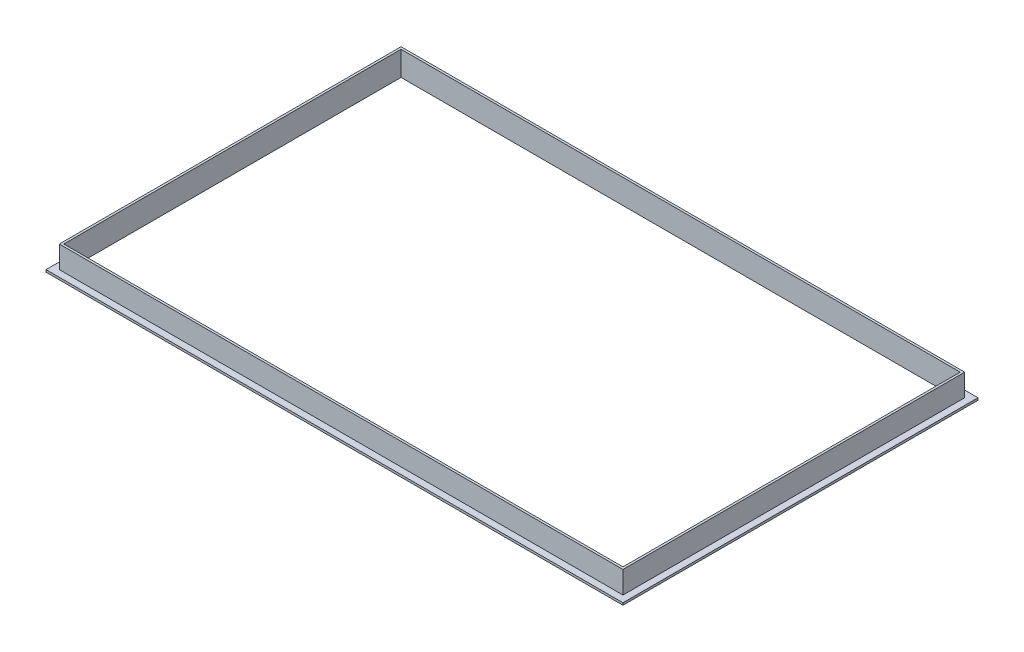
ISO-10303-21;
HEADER;
FILE_DESCRIPTION(('STEP AP214'),'2;1');
FILE_NAME('part.step','',(''),(''),'','','');
FILE_SCHEMA(('AUTOMOTIVE_DESIGN { 1 0 10303 214 1 1 1 1 }'));
ENDSEC;
DATA;
#1=APPLICATION_CONTEXT('core data for automotive mechanical design processes');
#2=APPLICATION_PROTOCOL_DEFINITION('international standard','automotive_design',2000,#1);
#3=PRODUCT_CONTEXT('',#1,'mechanical');
#4=PRODUCT('Part','Part','',(#3));
#5=PRODUCT_RELATED_PRODUCT_CATEGORY('part','',(#4));
#6=PRODUCT_DEFINITION_FORMATION('','',#4);
#7=PRODUCT_DEFINITION_CONTEXT('part definition',#1,'design');
#8=PRODUCT_DEFINITION('design','',#6,#7);
#9=PRODUCT_DEFINITION_SHAPE('','',#8);
#10=(LENGTH_UNIT() NAMED_UNIT(*) SI_UNIT(.MILLI.,.METRE.));
#11=(NAMED_UNIT(*) PLANE_ANGLE_UNIT() SI_UNIT($,.RADIAN.));
#12=(NAMED_UNIT(*) SI_UNIT($,.STERADIAN.) SOLID_ANGLE_UNIT());
#13=UNCERTAINTY_MEASURE_WITH_UNIT(LENGTH_MEASURE(1.E-05),#10,'distance_accuracy_value','');
#14=(GEOMETRIC_REPRESENTATION_CONTEXT(3) GLOBAL_UNCERTAINTY_ASSIGNED_CONTEXT((#13)) GLOBAL_UNIT_ASSIGNED_CONTEXT((#10,
#11,#12)) REPRESENTATION_CONTEXT('',''));
#15=CARTESIAN_POINT('',(0.,0.,0.));
#16=DIRECTION('',(0.,0.,1.));
#17=DIRECTION('',(1.,0.,0.));
#18=AXIS2_PLACEMENT_3D('',#15,#16,#17);
#19=CARTESIAN_POINT('',(0.,2.,0.));
#20=DIRECTION('',(0.,-1.,0.));
#21=DIRECTION('',(0.,0.,-1.));
#22=AXIS2_PLACEMENT_3D('',#19,#20,#21);
#23=PLANE('',#22);
#24=DIRECTION('',(0.,0.,1.));
#25=VECTOR('',#24,1.);
#26=CARTESIAN_POINT('',(0.,2.,0.));
#27=LINE('',#26,#25);
#28=CARTESIAN_POINT('',(0.,2.,-320.));
#29=VERTEX_POINT('',#28);
#30=CARTESIAN_POINT('',(0.,2.,0.));
#31=VERTEX_POINT('',#30);
#32=EDGE_CURVE('E191',#29,#31,#27,.T.);
#33=ORIENTED_EDGE('',*,*,#32,.T.);
#34=DIRECTION('',(1.,0.,0.));
#35=VECTOR('',#34,1.);
#36=CARTESIAN_POINT('',(0.,2.,0.));
#37=LINE('',#36,#35);
#38=CARTESIAN_POINT('',(520.,2.,0.));
#39=VERTEX_POINT('',#38);
#40=EDGE_CURVE('E194',#31,#39,#37,.T.);
#41=ORIENTED_EDGE('',*,*,#40,.T.);
#42=DIRECTION('',(0.,0.,-1.));
#43=VECTOR('',#42,1.);
#44=CARTESIAN_POINT('',(520.,2.,0.));
#45=LINE('',#44,#43);
#46=CARTESIAN_POINT('',(520.,2.,-320.));
#47=VERTEX_POINT('',#46);
#48=EDGE_CURVE('E197',#39,#47,#45,.T.);
#49=ORIENTED_EDGE('',*,*,#48,.T.);
#50=DIRECTION('',(-1.,0.,0.));
#51=VECTOR('',#50,1.);
#52=CARTESIAN_POINT('',(0.,2.,-320.));
#53=LINE('',#52,#51);
#54=EDGE_CURVE('E199',#47,#29,#53,.T.);
#55=ORIENTED_EDGE('',*,*,#54,.T.);
#56=EDGE_LOOP('',(#33,#41,#49,#55));
#57=FACE_BOUND('',#56,.T.);
#58=DIRECTION('',(0.,0.,1.));
#59=VECTOR('',#58,1.);
#60=CARTESIAN_POINT('',(6.,2.,-314.));
#61=LINE('',#60,#59);
#62=CARTESIAN_POINT('',(6.,2.,-314.));
#63=VERTEX_POINT('',#62);
#64=CARTESIAN_POINT('',(6.00000000000004,2.,-6.));
#65=VERTEX_POINT('',#64);
#66=EDGE_CURVE('E150',#63,#65,#61,.T.);
#67=ORIENTED_EDGE('',*,*,#66,.F.);
#68=DIRECTION('',(-1.,0.,0.));
#69=VECTOR('',#68,1.);
#70=CARTESIAN_POINT('',(6.,2.,-314.));
#71=LINE('',#70,#69);
#72=CARTESIAN_POINT('',(514.,2.,-314.));
#73=VERTEX_POINT('',#72);
#74=EDGE_CURVE('E155',#73,#63,#71,.T.);
#75=ORIENTED_EDGE('',*,*,#74,.F.);
#76=DIRECTION('',(0.,0.,-1.));
#77=VECTOR('',#76,1.);
#78=CARTESIAN_POINT('',(514.,2.,-314.));
#79=LINE('',#78,#77);
#80=CARTESIAN_POINT('',(514.,2.,-6.00000000000001));
#81=VERTEX_POINT('',#80);
#82=EDGE_CURVE('E53',#81,#73,#79,.T.);
#83=ORIENTED_EDGE('',*,*,#82,.F.);
#84=DIRECTION('',(1.,0.,0.));
#85=VECTOR('',#84,1.);
#86=CARTESIAN_POINT('',(6.00000000000004,2.,-6.));
#87=LINE('',#86,#85);
#88=EDGE_CURVE('E48',#65,#81,#87,.T.);
#89=ORIENTED_EDGE('',*,*,#88,.F.);
#90=EDGE_LOOP('',(#67,#75,#83,#89));
#91=FACE_BOUND('',#90,.T.);
#92=ADVANCED_FACE('F33',(#57,#91),#23,.F.);
#93=CARTESIAN_POINT('',(0.,0.,0.));
#94=DIRECTION('',(0.,-1.,0.));
#95=DIRECTION('',(0.,0.,-1.));
#96=AXIS2_PLACEMENT_3D('',#93,#94,#95);
#97=PLANE('',#96);
#98=DIRECTION('',(0.,0.,1.));
#99=VECTOR('',#98,1.);
#100=CARTESIAN_POINT('',(0.,0.,0.));
#101=LINE('',#100,#99);
#102=CARTESIAN_POINT('',(0.,0.,-320.));
#103=VERTEX_POINT('',#102);
#104=CARTESIAN_POINT('',(0.,0.,0.));
#105=VERTEX_POINT('',#104);
#106=EDGE_CURVE('E130',#103,#105,#101,.T.);
#107=ORIENTED_EDGE('',*,*,#106,.F.);
#108=DIRECTION('',(-1.,0.,0.));
#109=VECTOR('',#108,1.);
#110=CARTESIAN_POINT('',(0.,0.,-320.));
#111=LINE('',#110,#109);
#112=CARTESIAN_POINT('',(520.,0.,-320.));
#113=VERTEX_POINT('',#112);
#114=EDGE_CURVE('E195',#113,#103,#111,.T.);
#115=ORIENTED_EDGE('',*,*,#114,.F.);
#116=DIRECTION('',(0.,0.,-1.));
#117=VECTOR('',#116,1.);
#118=CARTESIAN_POINT('',(520.,0.,0.));
#119=LINE('',#118,#117);
#120=CARTESIAN_POINT('',(520.,0.,0.));
#121=VERTEX_POINT('',#120);
#122=EDGE_CURVE('E206',#121,#113,#119,.T.);
#123=ORIENTED_EDGE('',*,*,#122,.F.);
#124=DIRECTION('',(1.,0.,0.));
#125=VECTOR('',#124,1.);
#126=CARTESIAN_POINT('',(0.,0.,0.));
#127=LINE('',#126,#125);
#128=EDGE_CURVE('E204',#105,#121,#127,.T.);
#129=ORIENTED_EDGE('',*,*,#128,.F.);
#130=EDGE_LOOP('',(#107,#115,#123,#129));
#131=FACE_BOUND('',#130,.T.);
#132=DIRECTION('',(-1.,0.,0.));
#133=VECTOR('',#132,1.);
#134=CARTESIAN_POINT('',(8.,0.,-312.));
#135=LINE('',#134,#133);
#136=CARTESIAN_POINT('',(512.,0.,-312.));
#137=VERTEX_POINT('',#136);
#138=CARTESIAN_POINT('',(8.,0.,-312.));
#139=VERTEX_POINT('',#138);
#140=EDGE_CURVE('E184',#137,#139,#135,.T.);
#141=ORIENTED_EDGE('',*,*,#140,.T.);
#142=DIRECTION('',(0.,0.,1.));
#143=VECTOR('',#142,1.);
#144=CARTESIAN_POINT('',(8.,0.,-312.));
#145=LINE('',#144,#143);
#146=CARTESIAN_POINT('',(8.00000000000004,0.,-8.00000000000001));
#147=VERTEX_POINT('',#146);
#148=EDGE_CURVE('E178',#139,#147,#145,.T.);
#149=ORIENTED_EDGE('',*,*,#148,.T.);
#150=DIRECTION('',(1.,0.,0.));
#151=VECTOR('',#150,1.);
#152=CARTESIAN_POINT('',(8.00000000000004,0.,-8.00000000000001));
#153=LINE('',#152,#151);
#154=CARTESIAN_POINT('',(512.,0.,-8.));
#155=VERTEX_POINT('',#154);
#156=EDGE_CURVE('E127',#147,#155,#153,.T.);
#157=ORIENTED_EDGE('',*,*,#156,.T.);
#158=DIRECTION('',(0.,0.,-1.));
#159=VECTOR('',#158,1.);
#160=CARTESIAN_POINT('',(512.,0.,-312.));
#161=LINE('',#160,#159);
#162=EDGE_CURVE('E181',#155,#137,#161,.T.);
#163=ORIENTED_EDGE('',*,*,#162,.T.);
#164=EDGE_LOOP('',(#141,#149,#157,#163));
#165=FACE_BOUND('',#164,.T.);
#166=ADVANCED_FACE('F224',(#131,#165),#97,.T.);
#167=CARTESIAN_POINT('',(0.,2.,0.));
#168=DIRECTION('',(1.,0.,0.));
#169=DIRECTION('',(0.,0.,-1.));
#170=AXIS2_PLACEMENT_3D('',#167,#168,#169);
#171=PLANE('',#170);
#172=ORIENTED_EDGE('',*,*,#106,.T.);
#173=DIRECTION('',(0.,-1.,0.));
#174=VECTOR('',#173,1.);
#175=CARTESIAN_POINT('',(0.,2.,0.));
#176=LINE('',#175,#174);
#177=EDGE_CURVE('E11',#31,#105,#176,.T.);
#178=ORIENTED_EDGE('',*,*,#177,.F.);
#179=ORIENTED_EDGE('',*,*,#32,.F.);
#180=DIRECTION('',(0.,-1.,0.));
#181=VECTOR('',#180,1.);
#182=CARTESIAN_POINT('',(0.,2.,-320.));
#183=LINE('',#182,#181);
#184=EDGE_CURVE('E201',#29,#103,#183,.T.);
#185=ORIENTED_EDGE('',*,*,#184,.T.);
#186=EDGE_LOOP('',(#172,#178,#179,#185));
#187=FACE_BOUND('',#186,.T.);
#188=ADVANCED_FACE('F35',(#187),#171,.F.);
#189=CARTESIAN_POINT('',(0.,2.,0.));
#190=DIRECTION('',(0.,0.,-1.));
#191=DIRECTION('',(-1.,0.,0.));
#192=AXIS2_PLACEMENT_3D('',#189,#190,#191);
#193=PLANE('',#192);
#194=ORIENTED_EDGE('',*,*,#128,.T.);
#195=DIRECTION('',(0.,-1.,0.));
#196=VECTOR('',#195,1.);
#197=CARTESIAN_POINT('',(520.,2.,0.));
#198=LINE('',#197,#196);
#199=EDGE_CURVE('E41',#39,#121,#198,.T.);
#200=ORIENTED_EDGE('',*,*,#199,.F.);
#201=ORIENTED_EDGE('',*,*,#40,.F.);
#202=ORIENTED_EDGE('',*,*,#177,.T.);
#203=EDGE_LOOP('',(#194,#200,#201,#202));
#204=FACE_BOUND('',#203,.T.);
#205=ADVANCED_FACE('F234',(#204),#193,.F.);
#206=CARTESIAN_POINT('',(520.,2.,0.));
#207=DIRECTION('',(-1.,0.,0.));
#208=DIRECTION('',(0.,0.,1.));
#209=AXIS2_PLACEMENT_3D('',#206,#207,#208);
#210=PLANE('',#209);
#211=ORIENTED_EDGE('',*,*,#122,.T.);
#212=DIRECTION('',(0.,-1.,0.));
#213=VECTOR('',#212,1.);
#214=CARTESIAN_POINT('',(520.,2.,-320.));
#215=LINE('',#214,#213);
#216=EDGE_CURVE('E211',#47,#113,#215,.T.);
#217=ORIENTED_EDGE('',*,*,#216,.F.);
#218=ORIENTED_EDGE('',*,*,#48,.F.);
#219=ORIENTED_EDGE('',*,*,#199,.T.);
#220=EDGE_LOOP('',(#211,#217,#218,#219));
#221=FACE_BOUND('',#220,.T.);
#222=ADVANCED_FACE('F218',(#221),#210,.F.);
#223=CARTESIAN_POINT('',(0.,2.,-320.));
#224=DIRECTION('',(0.,0.,1.));
#225=DIRECTION('',(1.,0.,0.));
#226=AXIS2_PLACEMENT_3D('',#223,#224,#225);
#227=PLANE('',#226);
#228=ORIENTED_EDGE('',*,*,#114,.T.);
#229=ORIENTED_EDGE('',*,*,#184,.F.);
#230=ORIENTED_EDGE('',*,*,#54,.F.);
#231=ORIENTED_EDGE('',*,*,#216,.T.);
#232=EDGE_LOOP('',(#228,#229,#230,#231));
#233=FACE_BOUND('',#232,.T.);
#234=ADVANCED_FACE('F228',(#233),#227,.F.);
#235=CARTESIAN_POINT('',(8.,2.,-312.));
#236=DIRECTION('',(1.,0.,0.));
#237=DIRECTION('',(0.,0.,-1.));
#238=AXIS2_PLACEMENT_3D('',#235,#236,#237);
#239=PLANE('',#238);
#240=ORIENTED_EDGE('',*,*,#148,.F.);
#241=DIRECTION('',(0.,-1.,0.));
#242=VECTOR('',#241,1.);
#243=CARTESIAN_POINT('',(8.,2.,-312.));
#244=LINE('',#243,#242);
#245=CARTESIAN_POINT('',(8.,22.,-312.));
#246=VERTEX_POINT('',#245);
#247=EDGE_CURVE('E137',#246,#139,#244,.T.);
#248=ORIENTED_EDGE('',*,*,#247,.F.);
#249=DIRECTION('',(0.,0.,1.));
#250=VECTOR('',#249,1.);
#251=CARTESIAN_POINT('',(8.,22.,-312.));
#252=LINE('',#251,#250);
#253=CARTESIAN_POINT('',(8.00000000000004,22.,-8.));
#254=VERTEX_POINT('',#253);
#255=EDGE_CURVE('E134',#246,#254,#252,.T.);
#256=ORIENTED_EDGE('',*,*,#255,.T.);
#257=DIRECTION('',(0.,-1.,0.));
#258=VECTOR('',#257,1.);
#259=CARTESIAN_POINT('',(8.00000000000004,2.,-8.00000000000001));
#260=LINE('',#259,#258);
#261=EDGE_CURVE('E120',#254,#147,#260,.T.);
#262=ORIENTED_EDGE('',*,*,#261,.T.);
#263=EDGE_LOOP('',(#240,#248,#256,#262));
#264=FACE_BOUND('',#263,.T.);
#265=ADVANCED_FACE('F135',(#264),#239,.T.);
#266=CARTESIAN_POINT('',(8.00000000000004,2.,-8.00000000000001));
#267=DIRECTION('',(0.,0.,-1.));
#268=DIRECTION('',(-1.,0.,0.));
#269=AXIS2_PLACEMENT_3D('',#266,#267,#268);
#270=PLANE('',#269);
#271=ORIENTED_EDGE('',*,*,#156,.F.);
#272=ORIENTED_EDGE('',*,*,#261,.F.);
#273=DIRECTION('',(1.,0.,0.));
#274=VECTOR('',#273,1.);
#275=CARTESIAN_POINT('',(8.00000000000004,22.,-8.));
#276=LINE('',#275,#274);
#277=CARTESIAN_POINT('',(512.,22.,-8.));
#278=VERTEX_POINT('',#277);
#279=EDGE_CURVE('E124',#254,#278,#276,.T.);
#280=ORIENTED_EDGE('',*,*,#279,.T.);
#281=DIRECTION('',(0.,-1.,0.));
#282=VECTOR('',#281,1.);
#283=CARTESIAN_POINT('',(512.,2.,-8.));
#284=LINE('',#283,#282);
#285=EDGE_CURVE('E131',#278,#155,#284,.T.);
#286=ORIENTED_EDGE('',*,*,#285,.T.);
#287=EDGE_LOOP('',(#271,#272,#280,#286));
#288=FACE_BOUND('',#287,.T.);
#289=ADVANCED_FACE('F122',(#288),#270,.T.);
#290=CARTESIAN_POINT('',(512.,2.,-312.));
#291=DIRECTION('',(-1.,0.,0.));
#292=DIRECTION('',(0.,0.,1.));
#293=AXIS2_PLACEMENT_3D('',#290,#291,#292);
#294=PLANE('',#293);
#295=ORIENTED_EDGE('',*,*,#162,.F.);
#296=ORIENTED_EDGE('',*,*,#285,.F.);
#297=DIRECTION('',(0.,0.,-1.));
#298=VECTOR('',#297,1.);
#299=CARTESIAN_POINT('',(512.,22.,-312.));
#300=LINE('',#299,#298);
#301=CARTESIAN_POINT('',(512.,22.,-312.));
#302=VERTEX_POINT('',#301);
#303=EDGE_CURVE('E144',#278,#302,#300,.T.);
#304=ORIENTED_EDGE('',*,*,#303,.T.);
#305=DIRECTION('',(0.,-1.,0.));
#306=VECTOR('',#305,1.);
#307=CARTESIAN_POINT('',(512.,2.,-312.));
#308=LINE('',#307,#306);
#309=EDGE_CURVE('E188',#302,#137,#308,.T.);
#310=ORIENTED_EDGE('',*,*,#309,.T.);
#311=EDGE_LOOP('',(#295,#296,#304,#310));
#312=FACE_BOUND('',#311,.T.);
#313=ADVANCED_FACE('F257',(#312),#294,.T.);
#314=CARTESIAN_POINT('',(8.,2.,-312.));
#315=DIRECTION('',(0.,0.,1.));
#316=DIRECTION('',(1.,0.,0.));
#317=AXIS2_PLACEMENT_3D('',#314,#315,#316);
#318=PLANE('',#317);
#319=ORIENTED_EDGE('',*,*,#140,.F.);
#320=ORIENTED_EDGE('',*,*,#309,.F.);
#321=DIRECTION('',(-1.,0.,0.));
#322=VECTOR('',#321,1.);
#323=CARTESIAN_POINT('',(8.,22.,-312.));
#324=LINE('',#323,#322);
#325=EDGE_CURVE('E146',#302,#246,#324,.T.);
#326=ORIENTED_EDGE('',*,*,#325,.T.);
#327=ORIENTED_EDGE('',*,*,#247,.T.);
#328=EDGE_LOOP('',(#319,#320,#326,#327));
#329=FACE_BOUND('',#328,.T.);
#330=ADVANCED_FACE('F261',(#329),#318,.T.);
#331=CARTESIAN_POINT('',(0.,22.,0.));
#332=DIRECTION('',(0.,1.,0.));
#333=DIRECTION('',(0.,0.,1.));
#334=AXIS2_PLACEMENT_3D('',#331,#332,#333);
#335=PLANE('',#334);
#336=DIRECTION('',(0.,0.,1.));
#337=VECTOR('',#336,1.);
#338=CARTESIAN_POINT('',(6.,22.,-314.));
#339=LINE('',#338,#337);
#340=CARTESIAN_POINT('',(6.,22.,-314.));
#341=VERTEX_POINT('',#340);
#342=CARTESIAN_POINT('',(6.00000000000004,22.,-6.));
#343=VERTEX_POINT('',#342);
#344=EDGE_CURVE('E151',#341,#343,#339,.T.);
#345=ORIENTED_EDGE('',*,*,#344,.T.);
#346=DIRECTION('',(1.,0.,0.));
#347=VECTOR('',#346,1.);
#348=CARTESIAN_POINT('',(6.00000000000004,22.,-6.));
#349=LINE('',#348,#347);
#350=CARTESIAN_POINT('',(514.,22.,-6.00000000000001));
#351=VERTEX_POINT('',#350);
#352=EDGE_CURVE('E154',#343,#351,#349,.T.);
#353=ORIENTED_EDGE('',*,*,#352,.T.);
#354=DIRECTION('',(0.,0.,-1.));
#355=VECTOR('',#354,1.);
#356=CARTESIAN_POINT('',(514.,22.,-314.));
#357=LINE('',#356,#355);
#358=CARTESIAN_POINT('',(514.,22.,-314.));
#359=VERTEX_POINT('',#358);
#360=EDGE_CURVE('E157',#351,#359,#357,.T.);
#361=ORIENTED_EDGE('',*,*,#360,.T.);
#362=DIRECTION('',(-1.,0.,0.));
#363=VECTOR('',#362,1.);
#364=CARTESIAN_POINT('',(6.,22.,-314.));
#365=LINE('',#364,#363);
#366=EDGE_CURVE('E159',#359,#341,#365,.T.);
#367=ORIENTED_EDGE('',*,*,#366,.T.);
#368=EDGE_LOOP('',(#345,#353,#361,#367));
#369=FACE_BOUND('',#368,.T.);
#370=ORIENTED_EDGE('',*,*,#279,.F.);
#371=ORIENTED_EDGE('',*,*,#255,.F.);
#372=ORIENTED_EDGE('',*,*,#325,.F.);
#373=ORIENTED_EDGE('',*,*,#303,.F.);
#374=EDGE_LOOP('',(#370,#371,#372,#373));
#375=FACE_BOUND('',#374,.T.);
#376=ADVANCED_FACE('F142',(#369,#375),#335,.T.);
#377=CARTESIAN_POINT('',(6.,22.,-314.));
#378=DIRECTION('',(1.,0.,0.));
#379=DIRECTION('',(0.,0.,-1.));
#380=AXIS2_PLACEMENT_3D('',#377,#378,#379);
#381=PLANE('',#380);
#382=ORIENTED_EDGE('',*,*,#66,.T.);
#383=DIRECTION('',(0.,-1.,0.));
#384=VECTOR('',#383,1.);
#385=CARTESIAN_POINT('',(6.00000000000004,22.,-6.));
#386=LINE('',#385,#384);
#387=EDGE_CURVE('E176',#343,#65,#386,.T.);
#388=ORIENTED_EDGE('',*,*,#387,.F.);
#389=ORIENTED_EDGE('',*,*,#344,.F.);
#390=DIRECTION('',(0.,-1.,0.));
#391=VECTOR('',#390,1.);
#392=CARTESIAN_POINT('',(6.,22.,-314.));
#393=LINE('',#392,#391);
#394=EDGE_CURVE('E161',#341,#63,#393,.T.);
#395=ORIENTED_EDGE('',*,*,#394,.T.);
#396=EDGE_LOOP('',(#382,#388,#389,#395));
#397=FACE_BOUND('',#396,.T.);
#398=ADVANCED_FACE('F268',(#397),#381,.F.);
#399=CARTESIAN_POINT('',(6.00000000000004,22.,-6.));
#400=DIRECTION('',(0.,0.,-1.));
#401=DIRECTION('',(-1.,0.,0.));
#402=AXIS2_PLACEMENT_3D('',#399,#400,#401);
#403=PLANE('',#402);
#404=ORIENTED_EDGE('',*,*,#88,.T.);
#405=DIRECTION('',(0.,-1.,0.));
#406=VECTOR('',#405,1.);
#407=CARTESIAN_POINT('',(514.,22.,-6.00000000000001));
#408=LINE('',#407,#406);
#409=EDGE_CURVE('E173',#351,#81,#408,.T.);
#410=ORIENTED_EDGE('',*,*,#409,.F.);
#411=ORIENTED_EDGE('',*,*,#352,.F.);
#412=ORIENTED_EDGE('',*,*,#387,.T.);
#413=EDGE_LOOP('',(#404,#410,#411,#412));
#414=FACE_BOUND('',#413,.T.);
#415=ADVANCED_FACE('F271',(#414),#403,.F.);
#416=CARTESIAN_POINT('',(514.,22.,-314.));
#417=DIRECTION('',(-1.,0.,0.));
#418=DIRECTION('',(0.,0.,1.));
#419=AXIS2_PLACEMENT_3D('',#416,#417,#418);
#420=PLANE('',#419);
#421=ORIENTED_EDGE('',*,*,#82,.T.);
#422=DIRECTION('',(0.,-1.,0.));
#423=VECTOR('',#422,1.);
#424=CARTESIAN_POINT('',(514.,22.,-314.));
#425=LINE('',#424,#423);
#426=EDGE_CURVE('E170',#359,#73,#425,.T.);
#427=ORIENTED_EDGE('',*,*,#426,.F.);
#428=ORIENTED_EDGE('',*,*,#360,.F.);
#429=ORIENTED_EDGE('',*,*,#409,.T.);
#430=EDGE_LOOP('',(#421,#427,#428,#429));
#431=FACE_BOUND('',#430,.T.);
#432=ADVANCED_FACE('F275',(#431),#420,.F.);
#433=CARTESIAN_POINT('',(6.,22.,-314.));
#434=DIRECTION('',(0.,0.,1.));
#435=DIRECTION('',(1.,0.,0.));
#436=AXIS2_PLACEMENT_3D('',#433,#434,#435);
#437=PLANE('',#436);
#438=ORIENTED_EDGE('',*,*,#74,.T.);
#439=ORIENTED_EDGE('',*,*,#394,.F.);
#440=ORIENTED_EDGE('',*,*,#366,.F.);
#441=ORIENTED_EDGE('',*,*,#426,.T.);
#442=EDGE_LOOP('',(#438,#439,#440,#441));
#443=FACE_BOUND('',#442,.T.);
#444=ADVANCED_FACE('F279',(#443),#437,.F.);
#445=CLOSED_SHELL('',(#92,#166,#188,#205,#222,#234,#265,#289,#313,#330,#376,#398,#415,#432,#444));
#446=MANIFOLD_SOLID_BREP('B2',#445);
#447=ADVANCED_BREP_SHAPE_REPRESENTATION('',(#18,#446),#14);
#448=SHAPE_DEFINITION_REPRESENTATION(#9,#447);
ENDSEC;
END-ISO-10303-21;
